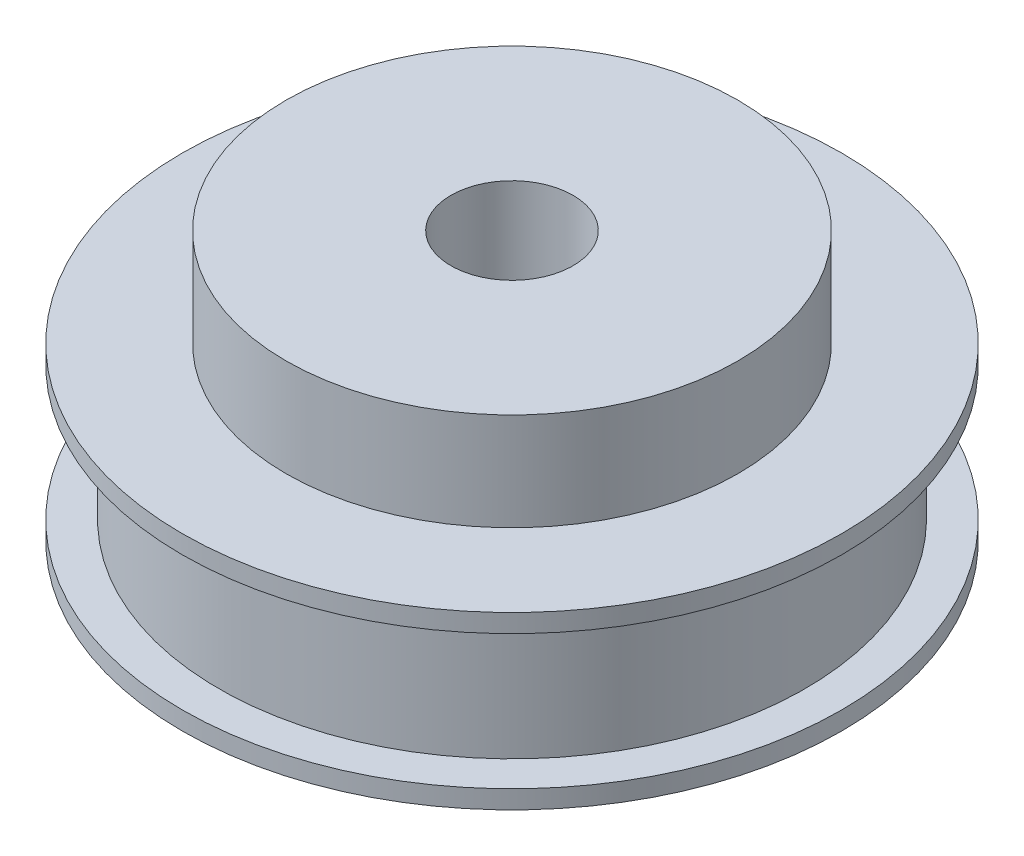
ISO-10303-21;
HEADER;
FILE_DESCRIPTION(('STEP AP214'),'2;1');
FILE_NAME('part.step','',(''),(''),'','','');
FILE_SCHEMA(('AUTOMOTIVE_DESIGN { 1 0 10303 214 1 1 1 1 }'));
ENDSEC;
DATA;
#1=APPLICATION_CONTEXT('core data for automotive mechanical design processes');
#2=APPLICATION_PROTOCOL_DEFINITION('international standard','automotive_design',2000,#1);
#3=PRODUCT_CONTEXT('',#1,'mechanical');
#4=PRODUCT('Part','Part','',(#3));
#5=PRODUCT_RELATED_PRODUCT_CATEGORY('part','',(#4));
#6=PRODUCT_DEFINITION_FORMATION('','',#4);
#7=PRODUCT_DEFINITION_CONTEXT('part definition',#1,'design');
#8=PRODUCT_DEFINITION('design','',#6,#7);
#9=PRODUCT_DEFINITION_SHAPE('','',#8);
#10=(LENGTH_UNIT() NAMED_UNIT(*) SI_UNIT(.MILLI.,.METRE.));
#11=(NAMED_UNIT(*) PLANE_ANGLE_UNIT() SI_UNIT($,.RADIAN.));
#12=(NAMED_UNIT(*) SI_UNIT($,.STERADIAN.) SOLID_ANGLE_UNIT());
#13=UNCERTAINTY_MEASURE_WITH_UNIT(LENGTH_MEASURE(1.E-05),#10,'distance_accuracy_value','');
#14=(GEOMETRIC_REPRESENTATION_CONTEXT(3) GLOBAL_UNCERTAINTY_ASSIGNED_CONTEXT((#13)) GLOBAL_UNIT_ASSIGNED_CONTEXT((#10,
#11,#12)) REPRESENTATION_CONTEXT('',''));
#15=CARTESIAN_POINT('',(0.,0.,0.));
#16=DIRECTION('',(0.,0.,1.));
#17=DIRECTION('',(1.,0.,0.));
#18=AXIS2_PLACEMENT_3D('',#15,#16,#17);
#19=CARTESIAN_POINT('',(0.,0.,0.));
#20=DIRECTION('',(0.,-1.,0.));
#21=DIRECTION('',(0.,0.,-1.));
#22=AXIS2_PLACEMENT_3D('',#19,#20,#21);
#23=CYLINDRICAL_SURFACE('',#22,5.);
#24=CARTESIAN_POINT('',(0.,0.,0.));
#25=DIRECTION('',(0.,-1.,0.));
#26=DIRECTION('',(0.,0.,-1.));
#27=AXIS2_PLACEMENT_3D('',#24,#25,#26);
#28=CIRCLE('',#27,5.);
#29=CARTESIAN_POINT('',(0.,0.,-5.));
#30=VERTEX_POINT('',#29);
#31=EDGE_CURVE('E10',#30,#30,#28,.T.);
#32=ORIENTED_EDGE('',*,*,#31,.T.);
#33=EDGE_LOOP('',(#32));
#34=FACE_BOUND('',#33,.T.);
#35=CARTESIAN_POINT('',(0.,22.,0.));
#36=DIRECTION('',(0.,-1.,0.));
#37=DIRECTION('',(0.,0.,-1.));
#38=AXIS2_PLACEMENT_3D('',#35,#36,#37);
#39=CIRCLE('',#38,5.);
#40=CARTESIAN_POINT('',(0.,22.,-5.));
#41=VERTEX_POINT('',#40);
#42=EDGE_CURVE('E64',#41,#41,#39,.T.);
#43=ORIENTED_EDGE('',*,*,#42,.F.);
#44=EDGE_LOOP('',(#43));
#45=FACE_BOUND('',#44,.T.);
#46=ADVANCED_FACE('F30',(#34,#45),#23,.F.);
#47=CARTESIAN_POINT('',(5.,0.,0.));
#48=DIRECTION('',(0.,-1.,0.));
#49=DIRECTION('',(0.,0.,-1.));
#50=AXIS2_PLACEMENT_3D('',#47,#48,#49);
#51=PLANE('',#50);
#52=CARTESIAN_POINT('',(0.,0.,0.));
#53=DIRECTION('',(0.,-1.,0.));
#54=DIRECTION('',(0.,0.,-1.));
#55=AXIS2_PLACEMENT_3D('',#52,#53,#54);
#56=CIRCLE('',#55,27.);
#57=CARTESIAN_POINT('',(0.,0.,-27.));
#58=VERTEX_POINT('',#57);
#59=EDGE_CURVE('E36',#58,#58,#56,.T.);
#60=ORIENTED_EDGE('',*,*,#59,.T.);
#61=EDGE_LOOP('',(#60));
#62=FACE_BOUND('',#61,.T.);
#63=ORIENTED_EDGE('',*,*,#31,.F.);
#64=EDGE_LOOP('',(#63));
#65=FACE_BOUND('',#64,.T.);
#66=ADVANCED_FACE('F72',(#62,#65),#51,.T.);
#67=CARTESIAN_POINT('',(0.,0.,0.));
#68=DIRECTION('',(0.,-1.,0.));
#69=DIRECTION('',(0.,0.,-1.));
#70=AXIS2_PLACEMENT_3D('',#67,#68,#69);
#71=CYLINDRICAL_SURFACE('',#70,27.);
#72=CARTESIAN_POINT('',(0.,1.5,0.));
#73=DIRECTION('',(0.,-1.,0.));
#74=DIRECTION('',(0.,0.,-1.));
#75=AXIS2_PLACEMENT_3D('',#72,#73,#74);
#76=CIRCLE('',#75,27.);
#77=CARTESIAN_POINT('',(0.,1.5,-27.));
#78=VERTEX_POINT('',#77);
#79=EDGE_CURVE('E40',#78,#78,#76,.T.);
#80=ORIENTED_EDGE('',*,*,#79,.T.);
#81=EDGE_LOOP('',(#80));
#82=FACE_BOUND('',#81,.T.);
#83=ORIENTED_EDGE('',*,*,#59,.F.);
#84=EDGE_LOOP('',(#83));
#85=FACE_BOUND('',#84,.T.);
#86=ADVANCED_FACE('F76',(#82,#85),#71,.T.);
#87=CARTESIAN_POINT('',(27.,1.5,0.));
#88=DIRECTION('',(0.,1.,0.));
#89=DIRECTION('',(0.,0.,1.));
#90=AXIS2_PLACEMENT_3D('',#87,#88,#89);
#91=PLANE('',#90);
#92=CARTESIAN_POINT('',(0.,1.5,0.));
#93=DIRECTION('',(0.,-1.,0.));
#94=DIRECTION('',(0.,0.,-1.));
#95=AXIS2_PLACEMENT_3D('',#92,#93,#94);
#96=CIRCLE('',#95,24.);
#97=CARTESIAN_POINT('',(0.,1.5,-24.));
#98=VERTEX_POINT('',#97);
#99=EDGE_CURVE('E44',#98,#98,#96,.T.);
#100=ORIENTED_EDGE('',*,*,#99,.T.);
#101=EDGE_LOOP('',(#100));
#102=FACE_BOUND('',#101,.T.);
#103=ORIENTED_EDGE('',*,*,#79,.F.);
#104=EDGE_LOOP('',(#103));
#105=FACE_BOUND('',#104,.T.);
#106=ADVANCED_FACE('F80',(#102,#105),#91,.T.);
#107=CARTESIAN_POINT('',(0.,0.,0.));
#108=DIRECTION('',(0.,-1.,0.));
#109=DIRECTION('',(0.,0.,-1.));
#110=AXIS2_PLACEMENT_3D('',#107,#108,#109);
#111=CYLINDRICAL_SURFACE('',#110,24.);
#112=CARTESIAN_POINT('',(0.,12.5,0.));
#113=DIRECTION('',(0.,-1.,0.));
#114=DIRECTION('',(0.,0.,-1.));
#115=AXIS2_PLACEMENT_3D('',#112,#113,#114);
#116=CIRCLE('',#115,24.);
#117=CARTESIAN_POINT('',(0.,12.5,-24.));
#118=VERTEX_POINT('',#117);
#119=EDGE_CURVE('E49',#118,#118,#116,.T.);
#120=ORIENTED_EDGE('',*,*,#119,.T.);
#121=EDGE_LOOP('',(#120));
#122=FACE_BOUND('',#121,.T.);
#123=ORIENTED_EDGE('',*,*,#99,.F.);
#124=EDGE_LOOP('',(#123));
#125=FACE_BOUND('',#124,.T.);
#126=ADVANCED_FACE('F87',(#122,#125),#111,.T.);
#127=CARTESIAN_POINT('',(24.,12.5,0.));
#128=DIRECTION('',(0.,-1.,0.));
#129=DIRECTION('',(0.,0.,-1.));
#130=AXIS2_PLACEMENT_3D('',#127,#128,#129);
#131=PLANE('',#130);
#132=CARTESIAN_POINT('',(0.,12.5,0.));
#133=DIRECTION('',(0.,-1.,0.));
#134=DIRECTION('',(0.,0.,-1.));
#135=AXIS2_PLACEMENT_3D('',#132,#133,#134);
#136=CIRCLE('',#135,27.);
#137=CARTESIAN_POINT('',(0.,12.5,-27.));
#138=VERTEX_POINT('',#137);
#139=EDGE_CURVE('E52',#138,#138,#136,.T.);
#140=ORIENTED_EDGE('',*,*,#139,.T.);
#141=EDGE_LOOP('',(#140));
#142=FACE_BOUND('',#141,.T.);
#143=ORIENTED_EDGE('',*,*,#119,.F.);
#144=EDGE_LOOP('',(#143));
#145=FACE_BOUND('',#144,.T.);
#146=ADVANCED_FACE('F91',(#142,#145),#131,.T.);
#147=CARTESIAN_POINT('',(0.,0.,0.));
#148=DIRECTION('',(0.,-1.,0.));
#149=DIRECTION('',(0.,0.,-1.));
#150=AXIS2_PLACEMENT_3D('',#147,#148,#149);
#151=CYLINDRICAL_SURFACE('',#150,27.);
#152=CARTESIAN_POINT('',(0.,14.,0.));
#153=DIRECTION('',(0.,-1.,0.));
#154=DIRECTION('',(0.,0.,-1.));
#155=AXIS2_PLACEMENT_3D('',#152,#153,#154);
#156=CIRCLE('',#155,27.);
#157=CARTESIAN_POINT('',(0.,14.,-27.));
#158=VERTEX_POINT('',#157);
#159=EDGE_CURVE('E55',#158,#158,#156,.T.);
#160=ORIENTED_EDGE('',*,*,#159,.T.);
#161=EDGE_LOOP('',(#160));
#162=FACE_BOUND('',#161,.T.);
#163=ORIENTED_EDGE('',*,*,#139,.F.);
#164=EDGE_LOOP('',(#163));
#165=FACE_BOUND('',#164,.T.);
#166=ADVANCED_FACE('F95',(#162,#165),#151,.T.);
#167=CARTESIAN_POINT('',(27.,14.,0.));
#168=DIRECTION('',(0.,1.,0.));
#169=DIRECTION('',(0.,0.,1.));
#170=AXIS2_PLACEMENT_3D('',#167,#168,#169);
#171=PLANE('',#170);
#172=CARTESIAN_POINT('',(0.,14.,0.));
#173=DIRECTION('',(0.,-1.,0.));
#174=DIRECTION('',(0.,0.,-1.));
#175=AXIS2_PLACEMENT_3D('',#172,#173,#174);
#176=CIRCLE('',#175,18.5);
#177=CARTESIAN_POINT('',(0.,14.,-18.5));
#178=VERTEX_POINT('',#177);
#179=EDGE_CURVE('E58',#178,#178,#176,.T.);
#180=ORIENTED_EDGE('',*,*,#179,.T.);
#181=EDGE_LOOP('',(#180));
#182=FACE_BOUND('',#181,.T.);
#183=ORIENTED_EDGE('',*,*,#159,.F.);
#184=EDGE_LOOP('',(#183));
#185=FACE_BOUND('',#184,.T.);
#186=ADVANCED_FACE('F99',(#182,#185),#171,.T.);
#187=CARTESIAN_POINT('',(0.,0.,0.));
#188=DIRECTION('',(0.,-1.,0.));
#189=DIRECTION('',(0.,0.,-1.));
#190=AXIS2_PLACEMENT_3D('',#187,#188,#189);
#191=CYLINDRICAL_SURFACE('',#190,18.5);
#192=CARTESIAN_POINT('',(0.,22.,0.));
#193=DIRECTION('',(0.,-1.,0.));
#194=DIRECTION('',(0.,0.,-1.));
#195=AXIS2_PLACEMENT_3D('',#192,#193,#194);
#196=CIRCLE('',#195,18.5);
#197=CARTESIAN_POINT('',(0.,22.,-18.5));
#198=VERTEX_POINT('',#197);
#199=EDGE_CURVE('E61',#198,#198,#196,.T.);
#200=ORIENTED_EDGE('',*,*,#199,.T.);
#201=EDGE_LOOP('',(#200));
#202=FACE_BOUND('',#201,.T.);
#203=ORIENTED_EDGE('',*,*,#179,.F.);
#204=EDGE_LOOP('',(#203));
#205=FACE_BOUND('',#204,.T.);
#206=ADVANCED_FACE('F103',(#202,#205),#191,.T.);
#207=CARTESIAN_POINT('',(18.5,22.,0.));
#208=DIRECTION('',(0.,1.,0.));
#209=DIRECTION('',(0.,0.,1.));
#210=AXIS2_PLACEMENT_3D('',#207,#208,#209);
#211=PLANE('',#210);
#212=ORIENTED_EDGE('',*,*,#42,.T.);
#213=EDGE_LOOP('',(#212));
#214=FACE_BOUND('',#213,.T.);
#215=ORIENTED_EDGE('',*,*,#199,.F.);
#216=EDGE_LOOP('',(#215));
#217=FACE_BOUND('',#216,.T.);
#218=ADVANCED_FACE('F68',(#214,#217),#211,.T.);
#219=CLOSED_SHELL('',(#46,#66,#86,#106,#126,#146,#166,#186,#206,#218));
#220=MANIFOLD_SOLID_BREP('B2',#219);
#221=ADVANCED_BREP_SHAPE_REPRESENTATION('',(#18,#220),#14);
#222=SHAPE_DEFINITION_REPRESENTATION(#9,#221);
ENDSEC;
END-ISO-10303-21;
